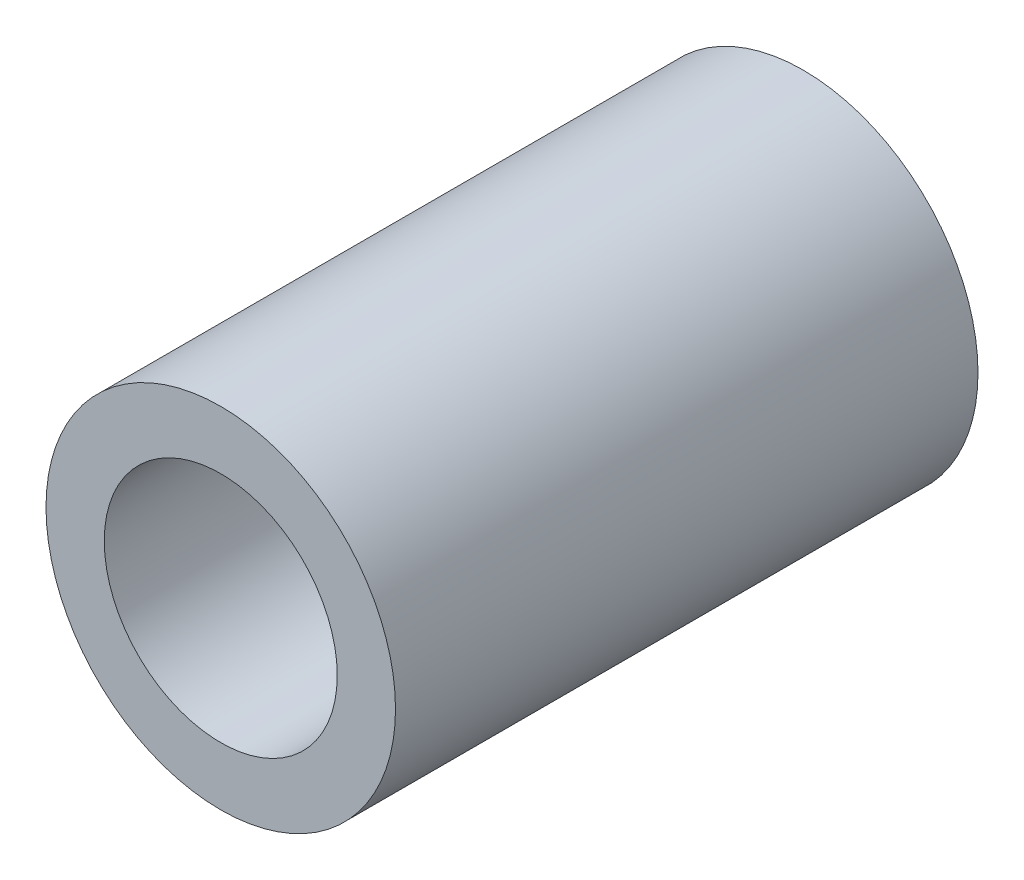
ISO-10303-21;
HEADER;
FILE_DESCRIPTION(('STEP AP214'),'2;1');
FILE_NAME('part.step','',(''),(''),'','','');
FILE_SCHEMA(('AUTOMOTIVE_DESIGN { 1 0 10303 214 1 1 1 1 }'));
ENDSEC;
DATA;
#1=APPLICATION_CONTEXT('core data for automotive mechanical design processes');
#2=APPLICATION_PROTOCOL_DEFINITION('international standard','automotive_design',2000,#1);
#3=PRODUCT_CONTEXT('',#1,'mechanical');
#4=PRODUCT('Part','Part','',(#3));
#5=PRODUCT_RELATED_PRODUCT_CATEGORY('part','',(#4));
#6=PRODUCT_DEFINITION_FORMATION('','',#4);
#7=PRODUCT_DEFINITION_CONTEXT('part definition',#1,'design');
#8=PRODUCT_DEFINITION('design','',#6,#7);
#9=PRODUCT_DEFINITION_SHAPE('','',#8);
#10=(LENGTH_UNIT() NAMED_UNIT(*) SI_UNIT(.MILLI.,.METRE.));
#11=(NAMED_UNIT(*) PLANE_ANGLE_UNIT() SI_UNIT($,.RADIAN.));
#12=(NAMED_UNIT(*) SI_UNIT($,.STERADIAN.) SOLID_ANGLE_UNIT());
#13=UNCERTAINTY_MEASURE_WITH_UNIT(LENGTH_MEASURE(1.E-05),#10,'distance_accuracy_value','');
#14=(GEOMETRIC_REPRESENTATION_CONTEXT(3) GLOBAL_UNCERTAINTY_ASSIGNED_CONTEXT((#13)) GLOBAL_UNIT_ASSIGNED_CONTEXT((#10,
#11,#12)) REPRESENTATION_CONTEXT('',''));
#15=CARTESIAN_POINT('',(0.,0.,0.));
#16=DIRECTION('',(0.,0.,1.));
#17=DIRECTION('',(1.,0.,0.));
#18=AXIS2_PLACEMENT_3D('',#15,#16,#17);
#19=CARTESIAN_POINT('',(0.,0.,50.));
#20=DIRECTION('',(0.,0.,1.));
#21=DIRECTION('',(1.,0.,0.));
#22=AXIS2_PLACEMENT_3D('',#19,#20,#21);
#23=PLANE('',#22);
#24=CARTESIAN_POINT('',(0.,0.,50.));
#25=DIRECTION('',(0.,0.,1.));
#26=DIRECTION('',(1.,0.,0.));
#27=AXIS2_PLACEMENT_3D('',#24,#25,#26);
#28=CIRCLE('',#27,15.);
#29=CARTESIAN_POINT('',(15.,0.,50.));
#30=VERTEX_POINT('',#29);
#31=EDGE_CURVE('E10',#30,#30,#28,.T.);
#32=ORIENTED_EDGE('',*,*,#31,.T.);
#33=EDGE_LOOP('',(#32));
#34=FACE_BOUND('',#33,.T.);
#35=CARTESIAN_POINT('',(0.,0.,50.));
#36=DIRECTION('',(0.,0.,1.));
#37=DIRECTION('',(1.,0.,0.));
#38=AXIS2_PLACEMENT_3D('',#35,#36,#37);
#39=CIRCLE('',#38,10.);
#40=CARTESIAN_POINT('',(10.,0.,50.));
#41=VERTEX_POINT('',#40);
#42=EDGE_CURVE('E50',#41,#41,#39,.T.);
#43=ORIENTED_EDGE('',*,*,#42,.F.);
#44=EDGE_LOOP('',(#43));
#45=FACE_BOUND('',#44,.T.);
#46=ADVANCED_FACE('F37',(#34,#45),#23,.T.);
#47=CARTESIAN_POINT('',(0.,0.,0.));
#48=DIRECTION('',(0.,0.,1.));
#49=DIRECTION('',(1.,0.,0.));
#50=AXIS2_PLACEMENT_3D('',#47,#48,#49);
#51=PLANE('',#50);
#52=CARTESIAN_POINT('',(0.,0.,0.));
#53=DIRECTION('',(0.,0.,1.));
#54=DIRECTION('',(1.,0.,0.));
#55=AXIS2_PLACEMENT_3D('',#52,#53,#54);
#56=CIRCLE('',#55,15.);
#57=CARTESIAN_POINT('',(15.,0.,0.));
#58=VERTEX_POINT('',#57);
#59=EDGE_CURVE('E41',#58,#58,#56,.T.);
#60=ORIENTED_EDGE('',*,*,#59,.F.);
#61=EDGE_LOOP('',(#60));
#62=FACE_BOUND('',#61,.T.);
#63=CARTESIAN_POINT('',(0.,0.,0.));
#64=DIRECTION('',(0.,0.,1.));
#65=DIRECTION('',(1.,0.,0.));
#66=AXIS2_PLACEMENT_3D('',#63,#64,#65);
#67=CIRCLE('',#66,10.);
#68=CARTESIAN_POINT('',(10.,0.,0.));
#69=VERTEX_POINT('',#68);
#70=EDGE_CURVE('E52',#69,#69,#67,.T.);
#71=ORIENTED_EDGE('',*,*,#70,.T.);
#72=EDGE_LOOP('',(#71));
#73=FACE_BOUND('',#72,.T.);
#74=ADVANCED_FACE('F64',(#62,#73),#51,.F.);
#75=CARTESIAN_POINT('',(0.,0.,50.));
#76=DIRECTION('',(0.,0.,-1.));
#77=DIRECTION('',(-1.,0.,0.));
#78=AXIS2_PLACEMENT_3D('',#75,#76,#77);
#79=CYLINDRICAL_SURFACE('',#78,15.);
#80=ORIENTED_EDGE('',*,*,#31,.F.);
#81=EDGE_LOOP('',(#80));
#82=FACE_BOUND('',#81,.T.);
#83=ORIENTED_EDGE('',*,*,#59,.T.);
#84=EDGE_LOOP('',(#83));
#85=FACE_BOUND('',#84,.T.);
#86=ADVANCED_FACE('F39',(#82,#85),#79,.T.);
#87=CARTESIAN_POINT('',(0.,0.,50.));
#88=DIRECTION('',(0.,0.,-1.));
#89=DIRECTION('',(-1.,0.,0.));
#90=AXIS2_PLACEMENT_3D('',#87,#88,#89);
#91=CYLINDRICAL_SURFACE('',#90,10.);
#92=ORIENTED_EDGE('',*,*,#42,.T.);
#93=EDGE_LOOP('',(#92));
#94=FACE_BOUND('',#93,.T.);
#95=ORIENTED_EDGE('',*,*,#70,.F.);
#96=EDGE_LOOP('',(#95));
#97=FACE_BOUND('',#96,.T.);
#98=ADVANCED_FACE('F60',(#94,#97),#91,.F.);
#99=CLOSED_SHELL('',(#46,#74,#86,#98));
#100=MANIFOLD_SOLID_BREP('B2',#99);
#101=ADVANCED_BREP_SHAPE_REPRESENTATION('',(#18,#100),#14);
#102=SHAPE_DEFINITION_REPRESENTATION(#9,#101);
ENDSEC;
END-ISO-10303-21;
